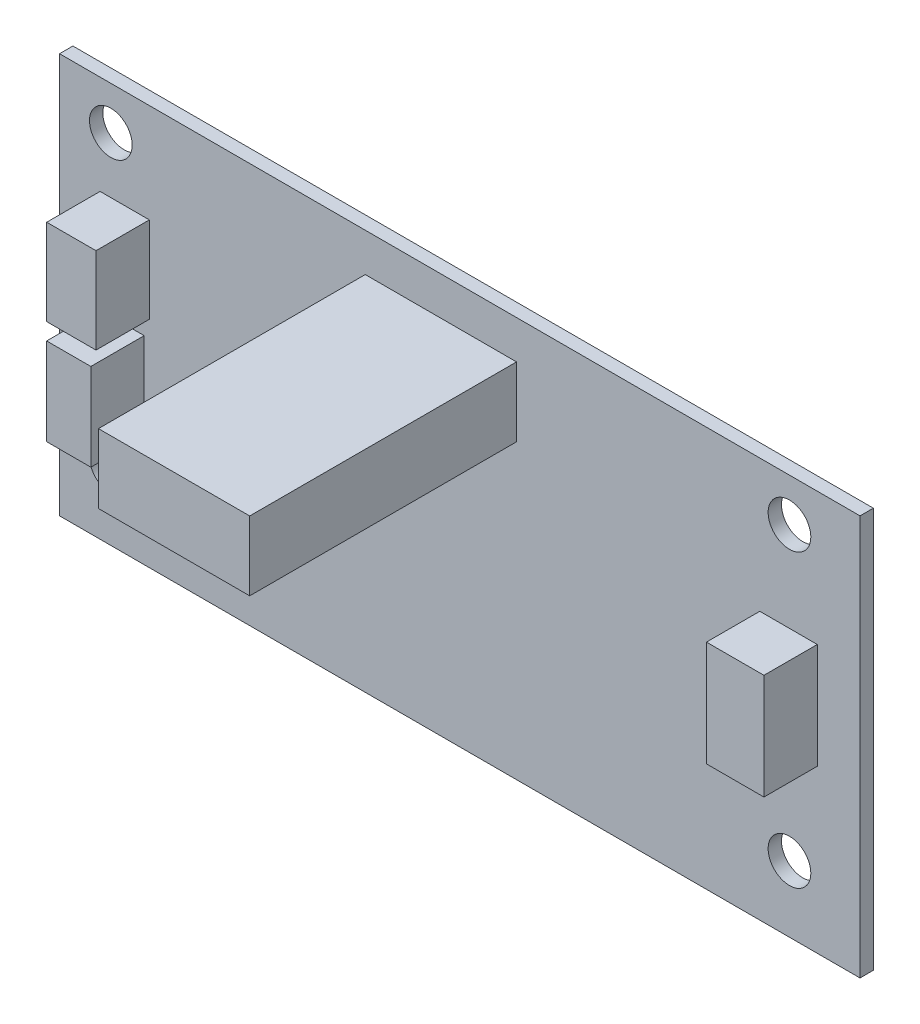
ISO-10303-21;
HEADER;
FILE_DESCRIPTION(('STEP AP214'),'2;1');
FILE_NAME('part.step','',(''),(''),'','','');
FILE_SCHEMA(('AUTOMOTIVE_DESIGN { 1 0 10303 214 1 1 1 1 }'));
ENDSEC;
DATA;
#1=APPLICATION_CONTEXT('core data for automotive mechanical design processes');
#2=APPLICATION_PROTOCOL_DEFINITION('international standard','automotive_design',2000,#1);
#3=PRODUCT_CONTEXT('',#1,'mechanical');
#4=PRODUCT('Part','Part','',(#3));
#5=PRODUCT_RELATED_PRODUCT_CATEGORY('part','',(#4));
#6=PRODUCT_DEFINITION_FORMATION('','',#4);
#7=PRODUCT_DEFINITION_CONTEXT('part definition',#1,'design');
#8=PRODUCT_DEFINITION('design','',#6,#7);
#9=PRODUCT_DEFINITION_SHAPE('','',#8);
#10=(LENGTH_UNIT() NAMED_UNIT(*) SI_UNIT(.MILLI.,.METRE.));
#11=(NAMED_UNIT(*) PLANE_ANGLE_UNIT() SI_UNIT($,.RADIAN.));
#12=(NAMED_UNIT(*) SI_UNIT($,.STERADIAN.) SOLID_ANGLE_UNIT());
#13=UNCERTAINTY_MEASURE_WITH_UNIT(LENGTH_MEASURE(1.E-05),#10,'distance_accuracy_value','');
#14=(GEOMETRIC_REPRESENTATION_CONTEXT(3) GLOBAL_UNCERTAINTY_ASSIGNED_CONTEXT((#13)) GLOBAL_UNIT_ASSIGNED_CONTEXT((#10,
#11,#12)) REPRESENTATION_CONTEXT('',''));
#15=CARTESIAN_POINT('',(0.,0.,0.));
#16=DIRECTION('',(0.,0.,1.));
#17=DIRECTION('',(1.,0.,0.));
#18=AXIS2_PLACEMENT_3D('',#15,#16,#17);
#19=CARTESIAN_POINT('',(0.,0.,1.));
#20=DIRECTION('',(0.,0.,1.));
#21=DIRECTION('',(1.,0.,0.));
#22=AXIS2_PLACEMENT_3D('',#19,#20,#21);
#23=PLANE('',#22);
#24=DIRECTION('',(-1.,0.,0.));
#25=VECTOR('',#24,1.);
#26=CARTESIAN_POINT('',(0.,8.3315183598144,1.));
#27=LINE('',#26,#25);
#28=CARTESIAN_POINT('',(-23.6558759481671,8.3315183598144,1.));
#29=VERTEX_POINT('',#28);
#30=CARTESIAN_POINT('',(-26.9678130532077,8.3315183598144,1.));
#31=VERTEX_POINT('',#30);
#32=EDGE_CURVE('E235',#29,#31,#27,.T.);
#33=ORIENTED_EDGE('',*,*,#32,.T.);
#34=DIRECTION('',(0.,1.,0.));
#35=VECTOR('',#34,1.);
#36=CARTESIAN_POINT('',(-26.9678130532077,0.,1.));
#37=LINE('',#36,#35);
#38=CARTESIAN_POINT('',(-26.9678130532077,14.8704711056637,1.));
#39=VERTEX_POINT('',#38);
#40=EDGE_CURVE('E238',#31,#39,#37,.T.);
#41=ORIENTED_EDGE('',*,*,#40,.T.);
#42=DIRECTION('',(1.,0.,0.));
#43=VECTOR('',#42,1.);
#44=CARTESIAN_POINT('',(0.,14.8704711056637,1.));
#45=LINE('',#44,#43);
#46=CARTESIAN_POINT('',(-23.6558759481671,14.8704711056637,1.));
#47=VERTEX_POINT('',#46);
#48=EDGE_CURVE('E229',#39,#47,#45,.T.);
#49=ORIENTED_EDGE('',*,*,#48,.T.);
#50=DIRECTION('',(0.,-1.,0.));
#51=VECTOR('',#50,1.);
#52=CARTESIAN_POINT('',(-23.6558759481671,0.,1.));
#53=LINE('',#52,#51);
#54=EDGE_CURVE('E232',#47,#29,#53,.T.);
#55=ORIENTED_EDGE('',*,*,#54,.T.);
#56=EDGE_LOOP('',(#33,#41,#49,#55));
#57=FACE_BOUND('',#56,.T.);
#58=DIRECTION('',(1.,0.,0.));
#59=VECTOR('',#58,1.);
#60=CARTESIAN_POINT('',(-7.08565448984899,21.9339736976565,1.));
#61=LINE('',#60,#59);
#62=CARTESIAN_POINT('',(-7.08565448984899,21.9339736976565,1.));
#63=VERTEX_POINT('',#62);
#64=CARTESIAN_POINT('',(4.25336122990672,21.9339736976565,1.));
#65=VERTEX_POINT('',#64);
#66=EDGE_CURVE('E287',#63,#65,#61,.T.);
#67=ORIENTED_EDGE('',*,*,#66,.F.);
#68=DIRECTION('',(0.,-1.,0.));
#69=VECTOR('',#68,1.);
#70=CARTESIAN_POINT('',(-7.08565448984899,27.1203380777223,1.));
#71=LINE('',#70,#69);
#72=CARTESIAN_POINT('',(-7.08565448984899,27.1203380777223,1.));
#73=VERTEX_POINT('',#72);
#74=EDGE_CURVE('E273',#73,#63,#71,.T.);
#75=ORIENTED_EDGE('',*,*,#74,.F.);
#76=DIRECTION('',(-1.,0.,0.));
#77=VECTOR('',#76,1.);
#78=CARTESIAN_POINT('',(-7.08565448984899,27.1203380777223,1.));
#79=LINE('',#78,#77);
#80=CARTESIAN_POINT('',(4.25336122990672,27.1203380777223,1.));
#81=VERTEX_POINT('',#80);
#82=EDGE_CURVE('E278',#81,#73,#79,.T.);
#83=ORIENTED_EDGE('',*,*,#82,.F.);
#84=DIRECTION('',(0.,1.,0.));
#85=VECTOR('',#84,1.);
#86=CARTESIAN_POINT('',(4.25336122990672,27.1203380777223,1.));
#87=LINE('',#86,#85);
#88=EDGE_CURVE('E289',#65,#81,#87,.T.);
#89=ORIENTED_EDGE('',*,*,#88,.F.);
#90=EDGE_LOOP('',(#67,#75,#83,#89));
#91=FACE_BOUND('',#90,.T.);
#92=CARTESIAN_POINT('',(24.7121460914564,4.95803685458858,1.));
#93=DIRECTION('',(0.,0.,1.));
#94=DIRECTION('',(1.,0.,0.));
#95=AXIS2_PLACEMENT_3D('',#92,#93,#94);
#96=CIRCLE('',#95,1.6);
#97=CARTESIAN_POINT('',(26.3121460914564,4.95803685458858,1.));
#98=VERTEX_POINT('',#97);
#99=EDGE_CURVE('E302',#98,#98,#96,.T.);
#100=ORIENTED_EDGE('',*,*,#99,.F.);
#101=EDGE_LOOP('',(#100));
#102=FACE_BOUND('',#101,.T.);
#103=CARTESIAN_POINT('',(24.7121460914564,26.7828531621635,1.));
#104=DIRECTION('',(0.,0.,1.));
#105=DIRECTION('',(1.,0.,0.));
#106=AXIS2_PLACEMENT_3D('',#103,#104,#105);
#107=CIRCLE('',#106,1.6);
#108=CARTESIAN_POINT('',(26.3121460914564,26.7828531621635,1.));
#109=VERTEX_POINT('',#108);
#110=EDGE_CURVE('E308',#109,#109,#107,.T.);
#111=ORIENTED_EDGE('',*,*,#110,.F.);
#112=EDGE_LOOP('',(#111));
#113=FACE_BOUND('',#112,.T.);
#114=CARTESIAN_POINT('',(-26.1558109833972,26.7828531621635,1.));
#115=DIRECTION('',(0.,0.,1.));
#116=DIRECTION('',(1.,0.,0.));
#117=AXIS2_PLACEMENT_3D('',#114,#115,#116);
#118=CIRCLE('',#117,1.6);
#119=CARTESIAN_POINT('',(-24.5558109833972,26.7828531621635,1.));
#120=VERTEX_POINT('',#119);
#121=EDGE_CURVE('E314',#120,#120,#118,.T.);
#122=ORIENTED_EDGE('',*,*,#121,.F.);
#123=EDGE_LOOP('',(#122));
#124=FACE_BOUND('',#123,.T.);
#125=CARTESIAN_POINT('',(-26.1558109833972,4.95803685458858,1.));
#126=DIRECTION('',(0.,0.,1.));
#127=DIRECTION('',(1.,0.,0.));
#128=AXIS2_PLACEMENT_3D('',#125,#126,#127);
#129=CIRCLE('',#128,1.6);
#130=CARTESIAN_POINT('',(-24.5558109833972,4.95803685458858,1.));
#131=VERTEX_POINT('',#130);
#132=EDGE_CURVE('E320',#131,#131,#129,.T.);
#133=ORIENTED_EDGE('',*,*,#132,.F.);
#134=EDGE_LOOP('',(#133));
#135=FACE_BOUND('',#134,.T.);
#136=DIRECTION('',(0.,-1.,0.));
#137=VECTOR('',#136,1.);
#138=CARTESIAN_POINT('',(-30.,30.,1.));
#139=LINE('',#138,#137);
#140=CARTESIAN_POINT('',(-30.,30.,1.));
#141=VERTEX_POINT('',#140);
#142=CARTESIAN_POINT('',(-30.,0.,1.));
#143=VERTEX_POINT('',#142);
#144=EDGE_CURVE('E327',#141,#143,#139,.T.);
#145=ORIENTED_EDGE('',*,*,#144,.T.);
#146=DIRECTION('',(1.,0.,0.));
#147=VECTOR('',#146,1.);
#148=CARTESIAN_POINT('',(-30.,0.,1.));
#149=LINE('',#148,#147);
#150=CARTESIAN_POINT('',(30.,0.,1.));
#151=VERTEX_POINT('',#150);
#152=EDGE_CURVE('E330',#143,#151,#149,.T.);
#153=ORIENTED_EDGE('',*,*,#152,.T.);
#154=DIRECTION('',(0.,1.,0.));
#155=VECTOR('',#154,1.);
#156=CARTESIAN_POINT('',(30.,30.,1.));
#157=LINE('',#156,#155);
#158=CARTESIAN_POINT('',(30.,30.,1.));
#159=VERTEX_POINT('',#158);
#160=EDGE_CURVE('E333',#151,#159,#157,.T.);
#161=ORIENTED_EDGE('',*,*,#160,.T.);
#162=DIRECTION('',(-1.,0.,0.));
#163=VECTOR('',#162,1.);
#164=CARTESIAN_POINT('',(-30.,30.,1.));
#165=LINE('',#164,#163);
#166=EDGE_CURVE('E335',#159,#141,#165,.T.);
#167=ORIENTED_EDGE('',*,*,#166,.T.);
#168=EDGE_LOOP('',(#145,#153,#161,#167));
#169=FACE_BOUND('',#168,.T.);
#170=DIRECTION('',(-1.,0.,0.));
#171=VECTOR('',#170,1.);
#172=CARTESIAN_POINT('',(0.,16.1252094010714,1.));
#173=LINE('',#172,#171);
#174=CARTESIAN_POINT('',(-23.2684811995157,16.1252094010714,1.));
#175=VERTEX_POINT('',#174);
#176=CARTESIAN_POINT('',(-26.9625648935994,16.1252094010714,1.));
#177=VERTEX_POINT('',#176);
#178=EDGE_CURVE('E267',#175,#177,#173,.T.);
#179=ORIENTED_EDGE('',*,*,#178,.T.);
#180=DIRECTION('',(0.,1.,0.));
#181=VECTOR('',#180,1.);
#182=CARTESIAN_POINT('',(-26.9625648935994,0.,1.));
#183=LINE('',#182,#181);
#184=CARTESIAN_POINT('',(-26.9625648935994,22.5792406826889,1.));
#185=VERTEX_POINT('',#184);
#186=EDGE_CURVE('E270',#177,#185,#183,.T.);
#187=ORIENTED_EDGE('',*,*,#186,.T.);
#188=DIRECTION('',(1.,0.,0.));
#189=VECTOR('',#188,1.);
#190=CARTESIAN_POINT('',(0.,22.5792406826889,1.));
#191=LINE('',#190,#189);
#192=CARTESIAN_POINT('',(-23.2684811995157,22.5792406826889,1.));
#193=VERTEX_POINT('',#192);
#194=EDGE_CURVE('E261',#185,#193,#191,.T.);
#195=ORIENTED_EDGE('',*,*,#194,.T.);
#196=DIRECTION('',(0.,-1.,0.));
#197=VECTOR('',#196,1.);
#198=CARTESIAN_POINT('',(-23.2684811995157,0.,1.));
#199=LINE('',#198,#197);
#200=EDGE_CURVE('E264',#193,#175,#199,.T.);
#201=ORIENTED_EDGE('',*,*,#200,.T.);
#202=EDGE_LOOP('',(#179,#187,#195,#201));
#203=FACE_BOUND('',#202,.T.);
#204=DIRECTION('',(-1.,0.,0.));
#205=VECTOR('',#204,1.);
#206=CARTESIAN_POINT('',(0.,12.1445064273737,1.));
#207=LINE('',#206,#205);
#208=CARTESIAN_POINT('',(26.797817597762,12.1445064273737,1.));
#209=VERTEX_POINT('',#208);
#210=CARTESIAN_POINT('',(22.4889483236113,12.1445064273737,1.));
#211=VERTEX_POINT('',#210);
#212=EDGE_CURVE('E207',#209,#211,#207,.T.);
#213=ORIENTED_EDGE('',*,*,#212,.T.);
#214=DIRECTION('',(0.,1.,0.));
#215=VECTOR('',#214,1.);
#216=CARTESIAN_POINT('',(22.4889483236113,0.,1.));
#217=LINE('',#216,#215);
#218=CARTESIAN_POINT('',(22.4889483236113,20.0494996822067,1.));
#219=VERTEX_POINT('',#218);
#220=EDGE_CURVE('E196',#211,#219,#217,.T.);
#221=ORIENTED_EDGE('',*,*,#220,.T.);
#222=DIRECTION('',(1.,0.,0.));
#223=VECTOR('',#222,1.);
#224=CARTESIAN_POINT('',(0.,20.0494996822067,1.));
#225=LINE('',#224,#223);
#226=CARTESIAN_POINT('',(26.797817597762,20.0494996822067,1.));
#227=VERTEX_POINT('',#226);
#228=EDGE_CURVE('E197',#219,#227,#225,.T.);
#229=ORIENTED_EDGE('',*,*,#228,.T.);
#230=DIRECTION('',(0.,-1.,0.));
#231=VECTOR('',#230,1.);
#232=CARTESIAN_POINT('',(26.797817597762,0.,1.));
#233=LINE('',#232,#231);
#234=EDGE_CURVE('E200',#227,#209,#233,.T.);
#235=ORIENTED_EDGE('',*,*,#234,.T.);
#236=EDGE_LOOP('',(#213,#221,#229,#235));
#237=FACE_BOUND('',#236,.T.);
#238=ADVANCED_FACE('F35',(#57,#91,#102,#113,#124,#135,#169,#203,#237),#23,.T.);
#239=CARTESIAN_POINT('',(-30.,30.,1.));
#240=DIRECTION('',(1.,0.,0.));
#241=DIRECTION('',(0.,1.,0.));
#242=AXIS2_PLACEMENT_3D('',#239,#240,#241);
#243=PLANE('',#242);
#244=DIRECTION('',(0.,-1.,0.));
#245=VECTOR('',#244,1.);
#246=CARTESIAN_POINT('',(-30.,30.,0.));
#247=LINE('',#246,#245);
#248=CARTESIAN_POINT('',(-30.,30.,0.));
#249=VERTEX_POINT('',#248);
#250=CARTESIAN_POINT('',(-30.,0.,0.));
#251=VERTEX_POINT('',#250);
#252=EDGE_CURVE('E326',#249,#251,#247,.T.);
#253=ORIENTED_EDGE('',*,*,#252,.T.);
#254=DIRECTION('',(0.,0.,-1.));
#255=VECTOR('',#254,1.);
#256=CARTESIAN_POINT('',(-30.,0.,1.));
#257=LINE('',#256,#255);
#258=EDGE_CURVE('E11',#143,#251,#257,.T.);
#259=ORIENTED_EDGE('',*,*,#258,.F.);
#260=ORIENTED_EDGE('',*,*,#144,.F.);
#261=DIRECTION('',(0.,0.,-1.));
#262=VECTOR('',#261,1.);
#263=CARTESIAN_POINT('',(-30.,30.,1.));
#264=LINE('',#263,#262);
#265=EDGE_CURVE('E337',#141,#249,#264,.T.);
#266=ORIENTED_EDGE('',*,*,#265,.T.);
#267=EDGE_LOOP('',(#253,#259,#260,#266));
#268=FACE_BOUND('',#267,.T.);
#269=ADVANCED_FACE('F37',(#268),#243,.F.);
#270=CARTESIAN_POINT('',(-30.,0.,1.));
#271=DIRECTION('',(0.,1.,0.));
#272=DIRECTION('',(0.,0.,1.));
#273=AXIS2_PLACEMENT_3D('',#270,#271,#272);
#274=PLANE('',#273);
#275=DIRECTION('',(1.,0.,0.));
#276=VECTOR('',#275,1.);
#277=CARTESIAN_POINT('',(-30.,0.,0.));
#278=LINE('',#277,#276);
#279=CARTESIAN_POINT('',(30.,0.,0.));
#280=VERTEX_POINT('',#279);
#281=EDGE_CURVE('E340',#251,#280,#278,.T.);
#282=ORIENTED_EDGE('',*,*,#281,.T.);
#283=DIRECTION('',(0.,0.,-1.));
#284=VECTOR('',#283,1.);
#285=CARTESIAN_POINT('',(30.,0.,1.));
#286=LINE('',#285,#284);
#287=EDGE_CURVE('E43',#151,#280,#286,.T.);
#288=ORIENTED_EDGE('',*,*,#287,.F.);
#289=ORIENTED_EDGE('',*,*,#152,.F.);
#290=ORIENTED_EDGE('',*,*,#258,.T.);
#291=EDGE_LOOP('',(#282,#288,#289,#290));
#292=FACE_BOUND('',#291,.T.);
#293=ADVANCED_FACE('F371',(#292),#274,.F.);
#294=CARTESIAN_POINT('',(30.,30.,1.));
#295=DIRECTION('',(-1.,0.,0.));
#296=DIRECTION('',(0.,-1.,0.));
#297=AXIS2_PLACEMENT_3D('',#294,#295,#296);
#298=PLANE('',#297);
#299=DIRECTION('',(0.,1.,0.));
#300=VECTOR('',#299,1.);
#301=CARTESIAN_POINT('',(30.,30.,0.));
#302=LINE('',#301,#300);
#303=CARTESIAN_POINT('',(30.,30.,0.));
#304=VERTEX_POINT('',#303);
#305=EDGE_CURVE('E342',#280,#304,#302,.T.);
#306=ORIENTED_EDGE('',*,*,#305,.T.);
#307=DIRECTION('',(0.,0.,-1.));
#308=VECTOR('',#307,1.);
#309=CARTESIAN_POINT('',(30.,30.,1.));
#310=LINE('',#309,#308);
#311=EDGE_CURVE('E347',#159,#304,#310,.T.);
#312=ORIENTED_EDGE('',*,*,#311,.F.);
#313=ORIENTED_EDGE('',*,*,#160,.F.);
#314=ORIENTED_EDGE('',*,*,#287,.T.);
#315=EDGE_LOOP('',(#306,#312,#313,#314));
#316=FACE_BOUND('',#315,.T.);
#317=ADVANCED_FACE('F354',(#316),#298,.F.);
#318=CARTESIAN_POINT('',(-30.,30.,1.));
#319=DIRECTION('',(0.,-1.,0.));
#320=DIRECTION('',(0.,0.,-1.));
#321=AXIS2_PLACEMENT_3D('',#318,#319,#320);
#322=PLANE('',#321);
#323=DIRECTION('',(-1.,0.,0.));
#324=VECTOR('',#323,1.);
#325=CARTESIAN_POINT('',(-30.,30.,0.));
#326=LINE('',#325,#324);
#327=EDGE_CURVE('E331',#304,#249,#326,.T.);
#328=ORIENTED_EDGE('',*,*,#327,.T.);
#329=ORIENTED_EDGE('',*,*,#265,.F.);
#330=ORIENTED_EDGE('',*,*,#166,.F.);
#331=ORIENTED_EDGE('',*,*,#311,.T.);
#332=EDGE_LOOP('',(#328,#329,#330,#331));
#333=FACE_BOUND('',#332,.T.);
#334=ADVANCED_FACE('F364',(#333),#322,.F.);
#335=CARTESIAN_POINT('',(0.,0.,0.));
#336=DIRECTION('',(0.,0.,1.));
#337=DIRECTION('',(1.,0.,0.));
#338=AXIS2_PLACEMENT_3D('',#335,#336,#337);
#339=PLANE('',#338);
#340=ORIENTED_EDGE('',*,*,#252,.F.);
#341=ORIENTED_EDGE('',*,*,#327,.F.);
#342=ORIENTED_EDGE('',*,*,#305,.F.);
#343=ORIENTED_EDGE('',*,*,#281,.F.);
#344=EDGE_LOOP('',(#340,#341,#342,#343));
#345=FACE_BOUND('',#344,.T.);
#346=CARTESIAN_POINT('',(-26.1558109833972,4.95803685458858,0.));
#347=DIRECTION('',(0.,0.,1.));
#348=DIRECTION('',(1.,0.,0.));
#349=AXIS2_PLACEMENT_3D('',#346,#347,#348);
#350=CIRCLE('',#349,1.6);
#351=CARTESIAN_POINT('',(-24.5558109833972,4.95803685458858,0.));
#352=VERTEX_POINT('',#351);
#353=EDGE_CURVE('E323',#352,#352,#350,.F.);
#354=ORIENTED_EDGE('',*,*,#353,.F.);
#355=EDGE_LOOP('',(#354));
#356=FACE_BOUND('',#355,.T.);
#357=CARTESIAN_POINT('',(-26.1558109833972,26.7828531621635,0.));
#358=DIRECTION('',(0.,0.,1.));
#359=DIRECTION('',(1.,0.,0.));
#360=AXIS2_PLACEMENT_3D('',#357,#358,#359);
#361=CIRCLE('',#360,1.6);
#362=CARTESIAN_POINT('',(-24.5558109833972,26.7828531621635,0.));
#363=VERTEX_POINT('',#362);
#364=EDGE_CURVE('E317',#363,#363,#361,.F.);
#365=ORIENTED_EDGE('',*,*,#364,.F.);
#366=EDGE_LOOP('',(#365));
#367=FACE_BOUND('',#366,.T.);
#368=CARTESIAN_POINT('',(24.7121460914564,26.7828531621635,0.));
#369=DIRECTION('',(0.,0.,1.));
#370=DIRECTION('',(1.,0.,0.));
#371=AXIS2_PLACEMENT_3D('',#368,#369,#370);
#372=CIRCLE('',#371,1.6);
#373=CARTESIAN_POINT('',(26.3121460914564,26.7828531621635,0.));
#374=VERTEX_POINT('',#373);
#375=EDGE_CURVE('E311',#374,#374,#372,.F.);
#376=ORIENTED_EDGE('',*,*,#375,.F.);
#377=EDGE_LOOP('',(#376));
#378=FACE_BOUND('',#377,.T.);
#379=CARTESIAN_POINT('',(24.7121460914564,4.95803685458858,0.));
#380=DIRECTION('',(0.,0.,1.));
#381=DIRECTION('',(1.,0.,0.));
#382=AXIS2_PLACEMENT_3D('',#379,#380,#381);
#383=CIRCLE('',#382,1.6);
#384=CARTESIAN_POINT('',(26.3121460914564,4.95803685458858,0.));
#385=VERTEX_POINT('',#384);
#386=EDGE_CURVE('E305',#385,#385,#383,.F.);
#387=ORIENTED_EDGE('',*,*,#386,.F.);
#388=EDGE_LOOP('',(#387));
#389=FACE_BOUND('',#388,.T.);
#390=ADVANCED_FACE('F360',(#345,#356,#367,#378,#389),#339,.F.);
#391=CARTESIAN_POINT('',(-26.1558109833972,4.95803685458858,-0.000999999999999916));
#392=DIRECTION('',(0.,0.,1.));
#393=DIRECTION('',(1.,0.,0.));
#394=AXIS2_PLACEMENT_3D('',#391,#392,#393);
#395=CYLINDRICAL_SURFACE('',#394,1.6);
#396=ORIENTED_EDGE('',*,*,#132,.T.);
#397=EDGE_LOOP('',(#396));
#398=FACE_BOUND('',#397,.T.);
#399=ORIENTED_EDGE('',*,*,#353,.T.);
#400=EDGE_LOOP('',(#399));
#401=FACE_BOUND('',#400,.T.);
#402=ADVANCED_FACE('F388',(#398,#401),#395,.F.);
#403=CARTESIAN_POINT('',(-26.1558109833972,26.7828531621635,-0.000999999999999916));
#404=DIRECTION('',(0.,0.,1.));
#405=DIRECTION('',(1.,0.,0.));
#406=AXIS2_PLACEMENT_3D('',#403,#404,#405);
#407=CYLINDRICAL_SURFACE('',#406,1.6);
#408=ORIENTED_EDGE('',*,*,#121,.T.);
#409=EDGE_LOOP('',(#408));
#410=FACE_BOUND('',#409,.T.);
#411=ORIENTED_EDGE('',*,*,#364,.T.);
#412=EDGE_LOOP('',(#411));
#413=FACE_BOUND('',#412,.T.);
#414=ADVANCED_FACE('F410',(#410,#413),#407,.F.);
#415=CARTESIAN_POINT('',(24.7121460914564,26.7828531621635,-0.000999999999999916));
#416=DIRECTION('',(0.,0.,1.));
#417=DIRECTION('',(1.,0.,0.));
#418=AXIS2_PLACEMENT_3D('',#415,#416,#417);
#419=CYLINDRICAL_SURFACE('',#418,1.6);
#420=ORIENTED_EDGE('',*,*,#110,.T.);
#421=EDGE_LOOP('',(#420));
#422=FACE_BOUND('',#421,.T.);
#423=ORIENTED_EDGE('',*,*,#375,.T.);
#424=EDGE_LOOP('',(#423));
#425=FACE_BOUND('',#424,.T.);
#426=ADVANCED_FACE('F416',(#422,#425),#419,.F.);
#427=CARTESIAN_POINT('',(24.7121460914564,4.95803685458858,-0.000999999999999916));
#428=DIRECTION('',(0.,0.,1.));
#429=DIRECTION('',(1.,0.,0.));
#430=AXIS2_PLACEMENT_3D('',#427,#428,#429);
#431=CYLINDRICAL_SURFACE('',#430,1.6);
#432=ORIENTED_EDGE('',*,*,#99,.T.);
#433=EDGE_LOOP('',(#432));
#434=FACE_BOUND('',#433,.T.);
#435=ORIENTED_EDGE('',*,*,#386,.T.);
#436=EDGE_LOOP('',(#435));
#437=FACE_BOUND('',#436,.T.);
#438=ADVANCED_FACE('F423',(#434,#437),#431,.F.);
#439=CARTESIAN_POINT('',(-7.08565448984899,27.1203380777223,21.));
#440=DIRECTION('',(1.,0.,0.));
#441=DIRECTION('',(0.,0.,-1.));
#442=AXIS2_PLACEMENT_3D('',#439,#440,#441);
#443=PLANE('',#442);
#444=ORIENTED_EDGE('',*,*,#74,.T.);
#445=DIRECTION('',(0.,0.,-1.));
#446=VECTOR('',#445,1.);
#447=CARTESIAN_POINT('',(-7.08565448984899,21.9339736976565,21.));
#448=LINE('',#447,#446);
#449=CARTESIAN_POINT('',(-7.08565448984899,21.9339736976565,21.));
#450=VERTEX_POINT('',#449);
#451=EDGE_CURVE('E300',#450,#63,#448,.T.);
#452=ORIENTED_EDGE('',*,*,#451,.F.);
#453=DIRECTION('',(0.,-1.,0.));
#454=VECTOR('',#453,1.);
#455=CARTESIAN_POINT('',(-7.08565448984899,27.1203380777223,21.));
#456=LINE('',#455,#454);
#457=CARTESIAN_POINT('',(-7.08565448984899,27.1203380777223,21.));
#458=VERTEX_POINT('',#457);
#459=EDGE_CURVE('E274',#458,#450,#456,.T.);
#460=ORIENTED_EDGE('',*,*,#459,.F.);
#461=DIRECTION('',(0.,0.,-1.));
#462=VECTOR('',#461,1.);
#463=CARTESIAN_POINT('',(-7.08565448984899,27.1203380777223,21.));
#464=LINE('',#463,#462);
#465=EDGE_CURVE('E284',#458,#73,#464,.T.);
#466=ORIENTED_EDGE('',*,*,#465,.T.);
#467=EDGE_LOOP('',(#444,#452,#460,#466));
#468=FACE_BOUND('',#467,.T.);
#469=ADVANCED_FACE('F430',(#468),#443,.F.);
#470=CARTESIAN_POINT('',(-7.08565448984899,21.9339736976565,21.));
#471=DIRECTION('',(0.,1.,0.));
#472=DIRECTION('',(0.,0.,1.));
#473=AXIS2_PLACEMENT_3D('',#470,#471,#472);
#474=PLANE('',#473);
#475=ORIENTED_EDGE('',*,*,#66,.T.);
#476=DIRECTION('',(0.,0.,-1.));
#477=VECTOR('',#476,1.);
#478=CARTESIAN_POINT('',(4.25336122990672,21.9339736976565,21.));
#479=LINE('',#478,#477);
#480=CARTESIAN_POINT('',(4.25336122990672,21.9339736976565,21.));
#481=VERTEX_POINT('',#480);
#482=EDGE_CURVE('E297',#481,#65,#479,.T.);
#483=ORIENTED_EDGE('',*,*,#482,.F.);
#484=DIRECTION('',(1.,0.,0.));
#485=VECTOR('',#484,1.);
#486=CARTESIAN_POINT('',(-7.08565448984899,21.9339736976565,21.));
#487=LINE('',#486,#485);
#488=EDGE_CURVE('E277',#450,#481,#487,.T.);
#489=ORIENTED_EDGE('',*,*,#488,.F.);
#490=ORIENTED_EDGE('',*,*,#451,.T.);
#491=EDGE_LOOP('',(#475,#483,#489,#490));
#492=FACE_BOUND('',#491,.T.);
#493=ADVANCED_FACE('F445',(#492),#474,.F.);
#494=CARTESIAN_POINT('',(4.25336122990672,27.1203380777223,21.));
#495=DIRECTION('',(-1.,0.,0.));
#496=DIRECTION('',(0.,0.,1.));
#497=AXIS2_PLACEMENT_3D('',#494,#495,#496);
#498=PLANE('',#497);
#499=ORIENTED_EDGE('',*,*,#88,.T.);
#500=DIRECTION('',(0.,0.,-1.));
#501=VECTOR('',#500,1.);
#502=CARTESIAN_POINT('',(4.25336122990672,27.1203380777223,21.));
#503=LINE('',#502,#501);
#504=CARTESIAN_POINT('',(4.25336122990672,27.1203380777223,21.));
#505=VERTEX_POINT('',#504);
#506=EDGE_CURVE('E295',#505,#81,#503,.T.);
#507=ORIENTED_EDGE('',*,*,#506,.F.);
#508=DIRECTION('',(0.,1.,0.));
#509=VECTOR('',#508,1.);
#510=CARTESIAN_POINT('',(4.25336122990672,27.1203380777223,21.));
#511=LINE('',#510,#509);
#512=EDGE_CURVE('E280',#481,#505,#511,.T.);
#513=ORIENTED_EDGE('',*,*,#512,.F.);
#514=ORIENTED_EDGE('',*,*,#482,.T.);
#515=EDGE_LOOP('',(#499,#507,#513,#514));
#516=FACE_BOUND('',#515,.T.);
#517=ADVANCED_FACE('F453',(#516),#498,.F.);
#518=CARTESIAN_POINT('',(-7.08565448984899,27.1203380777223,21.));
#519=DIRECTION('',(0.,-1.,0.));
#520=DIRECTION('',(0.,0.,-1.));
#521=AXIS2_PLACEMENT_3D('',#518,#519,#520);
#522=PLANE('',#521);
#523=ORIENTED_EDGE('',*,*,#82,.T.);
#524=ORIENTED_EDGE('',*,*,#465,.F.);
#525=DIRECTION('',(-1.,0.,0.));
#526=VECTOR('',#525,1.);
#527=CARTESIAN_POINT('',(-7.08565448984899,27.1203380777223,21.));
#528=LINE('',#527,#526);
#529=EDGE_CURVE('E282',#505,#458,#528,.T.);
#530=ORIENTED_EDGE('',*,*,#529,.F.);
#531=ORIENTED_EDGE('',*,*,#506,.T.);
#532=EDGE_LOOP('',(#523,#524,#530,#531));
#533=FACE_BOUND('',#532,.T.);
#534=ADVANCED_FACE('F461',(#533),#522,.F.);
#535=CARTESIAN_POINT('',(0.,0.,21.));
#536=DIRECTION('',(0.,0.,1.));
#537=DIRECTION('',(1.,0.,0.));
#538=AXIS2_PLACEMENT_3D('',#535,#536,#537);
#539=PLANE('',#538);
#540=ORIENTED_EDGE('',*,*,#459,.T.);
#541=ORIENTED_EDGE('',*,*,#488,.T.);
#542=ORIENTED_EDGE('',*,*,#512,.T.);
#543=ORIENTED_EDGE('',*,*,#529,.T.);
#544=EDGE_LOOP('',(#540,#541,#542,#543));
#545=FACE_BOUND('',#544,.T.);
#546=ADVANCED_FACE('F469',(#545),#539,.T.);
#547=CARTESIAN_POINT('',(-26.9625648935994,22.5792406826889,5.));
#548=DIRECTION('',(1.,0.,0.));
#549=DIRECTION('',(0.,0.,-1.));
#550=AXIS2_PLACEMENT_3D('',#547,#548,#549);
#551=PLANE('',#550);
#552=ORIENTED_EDGE('',*,*,#186,.F.);
#553=DIRECTION('',(0.,0.,-1.));
#554=VECTOR('',#553,1.);
#555=CARTESIAN_POINT('',(-26.9625648935994,16.1252094010714,5.));
#556=LINE('',#555,#554);
#557=CARTESIAN_POINT('',(-26.9625648935994,16.1252094010714,5.));
#558=VERTEX_POINT('',#557);
#559=EDGE_CURVE('E258',#558,#177,#556,.T.);
#560=ORIENTED_EDGE('',*,*,#559,.F.);
#561=DIRECTION('',(0.,-1.,0.));
#562=VECTOR('',#561,1.);
#563=CARTESIAN_POINT('',(-26.9625648935994,22.5792406826889,5.));
#564=LINE('',#563,#562);
#565=CARTESIAN_POINT('',(-26.9625648935994,22.5792406826889,5.));
#566=VERTEX_POINT('',#565);
#567=EDGE_CURVE('E241',#566,#558,#564,.T.);
#568=ORIENTED_EDGE('',*,*,#567,.F.);
#569=DIRECTION('',(0.,0.,-1.));
#570=VECTOR('',#569,1.);
#571=CARTESIAN_POINT('',(-26.9625648935994,22.5792406826889,5.));
#572=LINE('',#571,#570);
#573=EDGE_CURVE('E250',#566,#185,#572,.T.);
#574=ORIENTED_EDGE('',*,*,#573,.T.);
#575=EDGE_LOOP('',(#552,#560,#568,#574));
#576=FACE_BOUND('',#575,.T.);
#577=ADVANCED_FACE('F476',(#576),#551,.F.);
#578=CARTESIAN_POINT('',(-26.9625648935994,16.1252094010714,5.));
#579=DIRECTION('',(0.,1.,0.));
#580=DIRECTION('',(0.,0.,1.));
#581=AXIS2_PLACEMENT_3D('',#578,#579,#580);
#582=PLANE('',#581);
#583=ORIENTED_EDGE('',*,*,#178,.F.);
#584=DIRECTION('',(0.,0.,-1.));
#585=VECTOR('',#584,1.);
#586=CARTESIAN_POINT('',(-23.2684811995157,16.1252094010714,5.));
#587=LINE('',#586,#585);
#588=CARTESIAN_POINT('',(-23.2684811995157,16.1252094010714,5.));
#589=VERTEX_POINT('',#588);
#590=EDGE_CURVE('E255',#589,#175,#587,.T.);
#591=ORIENTED_EDGE('',*,*,#590,.F.);
#592=DIRECTION('',(1.,0.,0.));
#593=VECTOR('',#592,1.);
#594=CARTESIAN_POINT('',(-26.9625648935994,16.1252094010714,5.));
#595=LINE('',#594,#593);
#596=EDGE_CURVE('E244',#558,#589,#595,.T.);
#597=ORIENTED_EDGE('',*,*,#596,.F.);
#598=ORIENTED_EDGE('',*,*,#559,.T.);
#599=EDGE_LOOP('',(#583,#591,#597,#598));
#600=FACE_BOUND('',#599,.T.);
#601=ADVANCED_FACE('F482',(#600),#582,.F.);
#602=CARTESIAN_POINT('',(-23.2684811995157,22.5792406826889,5.));
#603=DIRECTION('',(-1.,0.,0.));
#604=DIRECTION('',(0.,0.,1.));
#605=AXIS2_PLACEMENT_3D('',#602,#603,#604);
#606=PLANE('',#605);
#607=ORIENTED_EDGE('',*,*,#200,.F.);
#608=DIRECTION('',(0.,0.,-1.));
#609=VECTOR('',#608,1.);
#610=CARTESIAN_POINT('',(-23.2684811995157,22.5792406826889,5.));
#611=LINE('',#610,#609);
#612=CARTESIAN_POINT('',(-23.2684811995157,22.5792406826889,5.));
#613=VERTEX_POINT('',#612);
#614=EDGE_CURVE('E253',#613,#193,#611,.T.);
#615=ORIENTED_EDGE('',*,*,#614,.F.);
#616=DIRECTION('',(0.,1.,0.));
#617=VECTOR('',#616,1.);
#618=CARTESIAN_POINT('',(-23.2684811995157,22.5792406826889,5.));
#619=LINE('',#618,#617);
#620=EDGE_CURVE('E246',#589,#613,#619,.T.);
#621=ORIENTED_EDGE('',*,*,#620,.F.);
#622=ORIENTED_EDGE('',*,*,#590,.T.);
#623=EDGE_LOOP('',(#607,#615,#621,#622));
#624=FACE_BOUND('',#623,.T.);
#625=ADVANCED_FACE('F489',(#624),#606,.F.);
#626=CARTESIAN_POINT('',(-26.9625648935994,22.5792406826889,5.));
#627=DIRECTION('',(0.,-1.,0.));
#628=DIRECTION('',(0.,0.,-1.));
#629=AXIS2_PLACEMENT_3D('',#626,#627,#628);
#630=PLANE('',#629);
#631=ORIENTED_EDGE('',*,*,#194,.F.);
#632=ORIENTED_EDGE('',*,*,#573,.F.);
#633=DIRECTION('',(-1.,0.,0.));
#634=VECTOR('',#633,1.);
#635=CARTESIAN_POINT('',(-26.9625648935994,22.5792406826889,5.));
#636=LINE('',#635,#634);
#637=EDGE_CURVE('E248',#613,#566,#636,.T.);
#638=ORIENTED_EDGE('',*,*,#637,.F.);
#639=ORIENTED_EDGE('',*,*,#614,.T.);
#640=EDGE_LOOP('',(#631,#632,#638,#639));
#641=FACE_BOUND('',#640,.T.);
#642=ADVANCED_FACE('F497',(#641),#630,.F.);
#643=CARTESIAN_POINT('',(0.,0.,5.));
#644=DIRECTION('',(0.,0.,1.));
#645=DIRECTION('',(1.,0.,0.));
#646=AXIS2_PLACEMENT_3D('',#643,#644,#645);
#647=PLANE('',#646);
#648=ORIENTED_EDGE('',*,*,#567,.T.);
#649=ORIENTED_EDGE('',*,*,#596,.T.);
#650=ORIENTED_EDGE('',*,*,#620,.T.);
#651=ORIENTED_EDGE('',*,*,#637,.T.);
#652=EDGE_LOOP('',(#648,#649,#650,#651));
#653=FACE_BOUND('',#652,.T.);
#654=ADVANCED_FACE('F505',(#653),#647,.T.);
#655=CARTESIAN_POINT('',(-26.9678130532077,14.8704711056637,5.));
#656=DIRECTION('',(1.,0.,0.));
#657=DIRECTION('',(0.,0.,-1.));
#658=AXIS2_PLACEMENT_3D('',#655,#656,#657);
#659=PLANE('',#658);
#660=ORIENTED_EDGE('',*,*,#40,.F.);
#661=DIRECTION('',(0.,0.,-1.));
#662=VECTOR('',#661,1.);
#663=CARTESIAN_POINT('',(-26.9678130532077,8.3315183598144,5.));
#664=LINE('',#663,#662);
#665=CARTESIAN_POINT('',(-26.9678130532077,8.3315183598144,5.));
#666=VERTEX_POINT('',#665);
#667=EDGE_CURVE('E226',#666,#31,#664,.T.);
#668=ORIENTED_EDGE('',*,*,#667,.F.);
#669=DIRECTION('',(0.,-1.,0.));
#670=VECTOR('',#669,1.);
#671=CARTESIAN_POINT('',(-26.9678130532077,14.8704711056637,5.));
#672=LINE('',#671,#670);
#673=CARTESIAN_POINT('',(-26.9678130532077,14.8704711056637,5.));
#674=VERTEX_POINT('',#673);
#675=EDGE_CURVE('E210',#674,#666,#672,.T.);
#676=ORIENTED_EDGE('',*,*,#675,.F.);
#677=DIRECTION('',(0.,0.,-1.));
#678=VECTOR('',#677,1.);
#679=CARTESIAN_POINT('',(-26.9678130532077,14.8704711056637,5.));
#680=LINE('',#679,#678);
#681=EDGE_CURVE('E219',#674,#39,#680,.T.);
#682=ORIENTED_EDGE('',*,*,#681,.T.);
#683=EDGE_LOOP('',(#660,#668,#676,#682));
#684=FACE_BOUND('',#683,.T.);
#685=ADVANCED_FACE('F513',(#684),#659,.F.);
#686=CARTESIAN_POINT('',(-26.9678130532077,8.3315183598144,5.));
#687=DIRECTION('',(0.,1.,0.));
#688=DIRECTION('',(0.,0.,1.));
#689=AXIS2_PLACEMENT_3D('',#686,#687,#688);
#690=PLANE('',#689);
#691=ORIENTED_EDGE('',*,*,#32,.F.);
#692=DIRECTION('',(0.,0.,-1.));
#693=VECTOR('',#692,1.);
#694=CARTESIAN_POINT('',(-23.6558759481671,8.3315183598144,5.));
#695=LINE('',#694,#693);
#696=CARTESIAN_POINT('',(-23.6558759481671,8.3315183598144,5.));
#697=VERTEX_POINT('',#696);
#698=EDGE_CURVE('E223',#697,#29,#695,.T.);
#699=ORIENTED_EDGE('',*,*,#698,.F.);
#700=DIRECTION('',(1.,0.,0.));
#701=VECTOR('',#700,1.);
#702=CARTESIAN_POINT('',(-26.9678130532077,8.3315183598144,5.));
#703=LINE('',#702,#701);
#704=EDGE_CURVE('E213',#666,#697,#703,.T.);
#705=ORIENTED_EDGE('',*,*,#704,.F.);
#706=ORIENTED_EDGE('',*,*,#667,.T.);
#707=EDGE_LOOP('',(#691,#699,#705,#706));
#708=FACE_BOUND('',#707,.T.);
#709=ADVANCED_FACE('F521',(#708),#690,.F.);
#710=CARTESIAN_POINT('',(-23.6558759481671,14.8704711056637,5.));
#711=DIRECTION('',(-1.,0.,0.));
#712=DIRECTION('',(0.,0.,1.));
#713=AXIS2_PLACEMENT_3D('',#710,#711,#712);
#714=PLANE('',#713);
#715=ORIENTED_EDGE('',*,*,#54,.F.);
#716=DIRECTION('',(0.,0.,-1.));
#717=VECTOR('',#716,1.);
#718=CARTESIAN_POINT('',(-23.6558759481671,14.8704711056637,5.));
#719=LINE('',#718,#717);
#720=CARTESIAN_POINT('',(-23.6558759481671,14.8704711056637,5.));
#721=VERTEX_POINT('',#720);
#722=EDGE_CURVE('E58',#721,#47,#719,.T.);
#723=ORIENTED_EDGE('',*,*,#722,.F.);
#724=DIRECTION('',(0.,1.,0.));
#725=VECTOR('',#724,1.);
#726=CARTESIAN_POINT('',(-23.6558759481671,14.8704711056637,5.));
#727=LINE('',#726,#725);
#728=EDGE_CURVE('E215',#697,#721,#727,.T.);
#729=ORIENTED_EDGE('',*,*,#728,.F.);
#730=ORIENTED_EDGE('',*,*,#698,.T.);
#731=EDGE_LOOP('',(#715,#723,#729,#730));
#732=FACE_BOUND('',#731,.T.);
#733=ADVANCED_FACE('F529',(#732),#714,.F.);
#734=CARTESIAN_POINT('',(-26.9678130532077,14.8704711056637,5.));
#735=DIRECTION('',(0.,-1.,0.));
#736=DIRECTION('',(0.,0.,-1.));
#737=AXIS2_PLACEMENT_3D('',#734,#735,#736);
#738=PLANE('',#737);
#739=ORIENTED_EDGE('',*,*,#48,.F.);
#740=ORIENTED_EDGE('',*,*,#681,.F.);
#741=DIRECTION('',(-1.,0.,0.));
#742=VECTOR('',#741,1.);
#743=CARTESIAN_POINT('',(-26.9678130532077,14.8704711056637,5.));
#744=LINE('',#743,#742);
#745=EDGE_CURVE('E217',#721,#674,#744,.T.);
#746=ORIENTED_EDGE('',*,*,#745,.F.);
#747=ORIENTED_EDGE('',*,*,#722,.T.);
#748=EDGE_LOOP('',(#739,#740,#746,#747));
#749=FACE_BOUND('',#748,.T.);
#750=ADVANCED_FACE('F537',(#749),#738,.F.);
#751=CARTESIAN_POINT('',(0.,0.,5.));
#752=DIRECTION('',(0.,0.,1.));
#753=DIRECTION('',(1.,0.,0.));
#754=AXIS2_PLACEMENT_3D('',#751,#752,#753);
#755=PLANE('',#754);
#756=ORIENTED_EDGE('',*,*,#675,.T.);
#757=ORIENTED_EDGE('',*,*,#704,.T.);
#758=ORIENTED_EDGE('',*,*,#728,.T.);
#759=ORIENTED_EDGE('',*,*,#745,.T.);
#760=EDGE_LOOP('',(#756,#757,#758,#759));
#761=FACE_BOUND('',#760,.T.);
#762=ADVANCED_FACE('F545',(#761),#755,.T.);
#763=CARTESIAN_POINT('',(22.4889483236113,20.0494996822067,5.));
#764=DIRECTION('',(1.,0.,0.));
#765=DIRECTION('',(0.,0.,-1.));
#766=AXIS2_PLACEMENT_3D('',#763,#764,#765);
#767=PLANE('',#766);
#768=ORIENTED_EDGE('',*,*,#220,.F.);
#769=DIRECTION('',(0.,0.,-1.));
#770=VECTOR('',#769,1.);
#771=CARTESIAN_POINT('',(22.4889483236113,12.1445064273737,5.));
#772=LINE('',#771,#770);
#773=CARTESIAN_POINT('',(22.4889483236113,12.1445064273737,5.));
#774=VERTEX_POINT('',#773);
#775=EDGE_CURVE('E178',#774,#211,#772,.T.);
#776=ORIENTED_EDGE('',*,*,#775,.F.);
#777=DIRECTION('',(0.,-1.,0.));
#778=VECTOR('',#777,1.);
#779=CARTESIAN_POINT('',(22.4889483236113,20.0494996822067,5.));
#780=LINE('',#779,#778);
#781=CARTESIAN_POINT('',(22.4889483236113,20.0494996822067,5.));
#782=VERTEX_POINT('',#781);
#783=EDGE_CURVE('E185',#782,#774,#780,.T.);
#784=ORIENTED_EDGE('',*,*,#783,.F.);
#785=DIRECTION('',(0.,0.,-1.));
#786=VECTOR('',#785,1.);
#787=CARTESIAN_POINT('',(22.4889483236113,20.0494996822067,5.));
#788=LINE('',#787,#786);
#789=EDGE_CURVE('E618',#782,#219,#788,.T.);
#790=ORIENTED_EDGE('',*,*,#789,.T.);
#791=EDGE_LOOP('',(#768,#776,#784,#790));
#792=FACE_BOUND('',#791,.T.);
#793=ADVANCED_FACE('F194',(#792),#767,.F.);
#794=CARTESIAN_POINT('',(22.4889483236113,12.1445064273737,5.));
#795=DIRECTION('',(0.,1.,0.));
#796=DIRECTION('',(0.,0.,1.));
#797=AXIS2_PLACEMENT_3D('',#794,#795,#796);
#798=PLANE('',#797);
#799=ORIENTED_EDGE('',*,*,#212,.F.);
#800=DIRECTION('',(0.,0.,-1.));
#801=VECTOR('',#800,1.);
#802=CARTESIAN_POINT('',(26.797817597762,12.1445064273737,5.));
#803=LINE('',#802,#801);
#804=CARTESIAN_POINT('',(26.797817597762,12.1445064273737,5.));
#805=VERTEX_POINT('',#804);
#806=EDGE_CURVE('E181',#805,#209,#803,.T.);
#807=ORIENTED_EDGE('',*,*,#806,.F.);
#808=DIRECTION('',(1.,0.,0.));
#809=VECTOR('',#808,1.);
#810=CARTESIAN_POINT('',(22.4889483236113,12.1445064273737,5.));
#811=LINE('',#810,#809);
#812=EDGE_CURVE('E174',#774,#805,#811,.T.);
#813=ORIENTED_EDGE('',*,*,#812,.F.);
#814=ORIENTED_EDGE('',*,*,#775,.T.);
#815=EDGE_LOOP('',(#799,#807,#813,#814));
#816=FACE_BOUND('',#815,.T.);
#817=ADVANCED_FACE('F176',(#816),#798,.F.);
#818=CARTESIAN_POINT('',(26.797817597762,20.0494996822067,5.));
#819=DIRECTION('',(-1.,0.,0.));
#820=DIRECTION('',(0.,0.,1.));
#821=AXIS2_PLACEMENT_3D('',#818,#819,#820);
#822=PLANE('',#821);
#823=ORIENTED_EDGE('',*,*,#234,.F.);
#824=DIRECTION('',(0.,0.,-1.));
#825=VECTOR('',#824,1.);
#826=CARTESIAN_POINT('',(26.797817597762,20.0494996822067,5.));
#827=LINE('',#826,#825);
#828=CARTESIAN_POINT('',(26.797817597762,20.0494996822067,5.));
#829=VERTEX_POINT('',#828);
#830=EDGE_CURVE('E50',#829,#227,#827,.T.);
#831=ORIENTED_EDGE('',*,*,#830,.F.);
#832=DIRECTION('',(0.,1.,0.));
#833=VECTOR('',#832,1.);
#834=CARTESIAN_POINT('',(26.797817597762,20.0494996822067,5.));
#835=LINE('',#834,#833);
#836=EDGE_CURVE('E184',#805,#829,#835,.T.);
#837=ORIENTED_EDGE('',*,*,#836,.F.);
#838=ORIENTED_EDGE('',*,*,#806,.T.);
#839=EDGE_LOOP('',(#823,#831,#837,#838));
#840=FACE_BOUND('',#839,.T.);
#841=ADVANCED_FACE('F565',(#840),#822,.F.);
#842=CARTESIAN_POINT('',(22.4889483236113,20.0494996822067,5.));
#843=DIRECTION('',(0.,-1.,0.));
#844=DIRECTION('',(0.,0.,-1.));
#845=AXIS2_PLACEMENT_3D('',#842,#843,#844);
#846=PLANE('',#845);
#847=ORIENTED_EDGE('',*,*,#228,.F.);
#848=ORIENTED_EDGE('',*,*,#789,.F.);
#849=DIRECTION('',(-1.,0.,0.));
#850=VECTOR('',#849,1.);
#851=CARTESIAN_POINT('',(22.4889483236113,20.0494996822067,5.));
#852=LINE('',#851,#850);
#853=EDGE_CURVE('E189',#829,#782,#852,.T.);
#854=ORIENTED_EDGE('',*,*,#853,.F.);
#855=ORIENTED_EDGE('',*,*,#830,.T.);
#856=EDGE_LOOP('',(#847,#848,#854,#855));
#857=FACE_BOUND('',#856,.T.);
#858=ADVANCED_FACE('F572',(#857),#846,.F.);
#859=CARTESIAN_POINT('',(0.,0.,5.));
#860=DIRECTION('',(0.,0.,1.));
#861=DIRECTION('',(1.,0.,0.));
#862=AXIS2_PLACEMENT_3D('',#859,#860,#861);
#863=PLANE('',#862);
#864=ORIENTED_EDGE('',*,*,#783,.T.);
#865=ORIENTED_EDGE('',*,*,#812,.T.);
#866=ORIENTED_EDGE('',*,*,#836,.T.);
#867=ORIENTED_EDGE('',*,*,#853,.T.);
#868=EDGE_LOOP('',(#864,#865,#866,#867));
#869=FACE_BOUND('',#868,.T.);
#870=ADVANCED_FACE('F188',(#869),#863,.T.);
#871=CLOSED_SHELL('',(#238,#269,#293,#317,#334,#390,#402,#414,#426,#438,#469,#493,#517,#534,
#546,#577,#601,#625,#642,#654,#685,#709,#733,#750,#762,#793,#817,#841,#858,#870));
#872=MANIFOLD_SOLID_BREP('B2',#871);
#873=ADVANCED_BREP_SHAPE_REPRESENTATION('',(#18,#872),#14);
#874=SHAPE_DEFINITION_REPRESENTATION(#9,#873);
ENDSEC;
END-ISO-10303-21;
